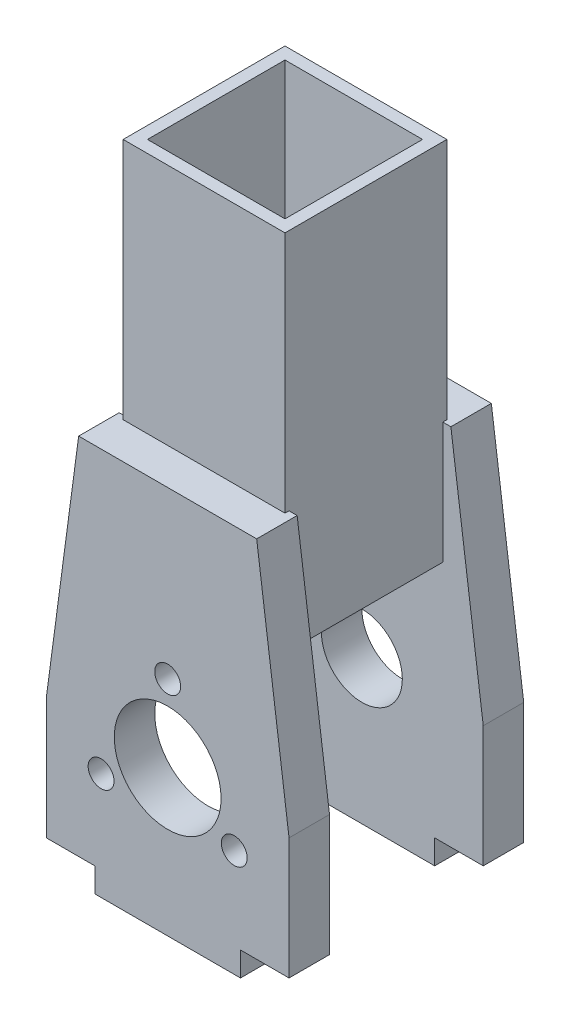
ISO-10303-21;
HEADER;
FILE_DESCRIPTION(('STEP AP214'),'2;1');
FILE_NAME('part.step','',(''),(''),'','','');
FILE_SCHEMA(('AUTOMOTIVE_DESIGN { 1 0 10303 214 1 1 1 1 }'));
ENDSEC;
DATA;
#1=APPLICATION_CONTEXT('core data for automotive mechanical design processes');
#2=APPLICATION_PROTOCOL_DEFINITION('international standard','automotive_design',2000,#1);
#3=PRODUCT_CONTEXT('',#1,'mechanical');
#4=PRODUCT('Part','Part','',(#3));
#5=PRODUCT_RELATED_PRODUCT_CATEGORY('part','',(#4));
#6=PRODUCT_DEFINITION_FORMATION('','',#4);
#7=PRODUCT_DEFINITION_CONTEXT('part definition',#1,'design');
#8=PRODUCT_DEFINITION('design','',#6,#7);
#9=PRODUCT_DEFINITION_SHAPE('','',#8);
#10=(LENGTH_UNIT() NAMED_UNIT(*) SI_UNIT(.MILLI.,.METRE.));
#11=(NAMED_UNIT(*) PLANE_ANGLE_UNIT() SI_UNIT($,.RADIAN.));
#12=(NAMED_UNIT(*) SI_UNIT($,.STERADIAN.) SOLID_ANGLE_UNIT());
#13=UNCERTAINTY_MEASURE_WITH_UNIT(LENGTH_MEASURE(1.E-05),#10,'distance_accuracy_value','');
#14=(GEOMETRIC_REPRESENTATION_CONTEXT(3) GLOBAL_UNCERTAINTY_ASSIGNED_CONTEXT((#13)) GLOBAL_UNIT_ASSIGNED_CONTEXT((#10,
#11,#12)) REPRESENTATION_CONTEXT('',''));
#15=CARTESIAN_POINT('',(0.,0.,0.));
#16=DIRECTION('',(0.,0.,1.));
#17=DIRECTION('',(1.,0.,0.));
#18=AXIS2_PLACEMENT_3D('',#15,#16,#17);
#19=CARTESIAN_POINT('',(1.00298557338295E-13,75.,0.));
#20=DIRECTION('',(0.,1.,0.));
#21=DIRECTION('',(-1.,0.,0.));
#22=AXIS2_PLACEMENT_3D('',#19,#20,#21);
#23=PLANE('',#22);
#24=DIRECTION('',(0.,0.,-1.));
#25=VECTOR('',#24,1.);
#26=CARTESIAN_POINT('',(10.0000000000001,75.,-10.));
#27=LINE('',#26,#25);
#28=CARTESIAN_POINT('',(10.0000000000001,75.,10.));
#29=VERTEX_POINT('',#28);
#30=CARTESIAN_POINT('',(10.0000000000001,75.,-10.));
#31=VERTEX_POINT('',#30);
#32=EDGE_CURVE('E122',#29,#31,#27,.T.);
#33=ORIENTED_EDGE('',*,*,#32,.T.);
#34=DIRECTION('',(-1.,0.,0.));
#35=VECTOR('',#34,1.);
#36=CARTESIAN_POINT('',(-9.99999999999991,75.,-10.));
#37=LINE('',#36,#35);
#38=CARTESIAN_POINT('',(-9.99999999999991,75.,-10.));
#39=VERTEX_POINT('',#38);
#40=EDGE_CURVE('E165',#31,#39,#37,.T.);
#41=ORIENTED_EDGE('',*,*,#40,.T.);
#42=DIRECTION('',(0.,0.,1.));
#43=VECTOR('',#42,1.);
#44=CARTESIAN_POINT('',(-9.99999999999991,75.,-10.));
#45=LINE('',#44,#43);
#46=CARTESIAN_POINT('',(-9.9999999999999,75.,10.));
#47=VERTEX_POINT('',#46);
#48=EDGE_CURVE('E167',#39,#47,#45,.T.);
#49=ORIENTED_EDGE('',*,*,#48,.T.);
#50=DIRECTION('',(1.,0.,0.));
#51=VECTOR('',#50,1.);
#52=CARTESIAN_POINT('',(-9.9999999999999,75.,10.));
#53=LINE('',#52,#51);
#54=EDGE_CURVE('E69',#47,#29,#53,.T.);
#55=ORIENTED_EDGE('',*,*,#54,.T.);
#56=EDGE_LOOP('',(#33,#41,#49,#55));
#57=FACE_BOUND('',#56,.T.);
#58=DIRECTION('',(1.,0.,0.));
#59=VECTOR('',#58,1.);
#60=CARTESIAN_POINT('',(-8.49999999999991,75.,8.5));
#61=LINE('',#60,#59);
#62=CARTESIAN_POINT('',(-8.49999999999991,75.,8.5));
#63=VERTEX_POINT('',#62);
#64=CARTESIAN_POINT('',(8.50000000000009,75.,8.5));
#65=VERTEX_POINT('',#64);
#66=EDGE_CURVE('E154',#63,#65,#61,.T.);
#67=ORIENTED_EDGE('',*,*,#66,.F.);
#68=DIRECTION('',(0.,0.,1.));
#69=VECTOR('',#68,1.);
#70=CARTESIAN_POINT('',(-8.49999999999991,75.,-8.5));
#71=LINE('',#70,#69);
#72=CARTESIAN_POINT('',(-8.49999999999991,75.,-8.5));
#73=VERTEX_POINT('',#72);
#74=EDGE_CURVE('E119',#73,#63,#71,.T.);
#75=ORIENTED_EDGE('',*,*,#74,.F.);
#76=DIRECTION('',(-1.,0.,0.));
#77=VECTOR('',#76,1.);
#78=CARTESIAN_POINT('',(-8.49999999999991,75.,-8.5));
#79=LINE('',#78,#77);
#80=CARTESIAN_POINT('',(8.50000000000009,75.,-8.5));
#81=VERTEX_POINT('',#80);
#82=EDGE_CURVE('E158',#81,#73,#79,.T.);
#83=ORIENTED_EDGE('',*,*,#82,.F.);
#84=DIRECTION('',(0.,0.,-1.));
#85=VECTOR('',#84,1.);
#86=CARTESIAN_POINT('',(8.50000000000009,75.,-8.5));
#87=LINE('',#86,#85);
#88=EDGE_CURVE('E156',#65,#81,#87,.T.);
#89=ORIENTED_EDGE('',*,*,#88,.F.);
#90=EDGE_LOOP('',(#67,#75,#83,#89));
#91=FACE_BOUND('',#90,.T.);
#92=ADVANCED_FACE('F46',(#57,#91),#23,.T.);
#93=CARTESIAN_POINT('',(10.0000000000001,75.,-10.));
#94=DIRECTION('',(-1.,0.,0.));
#95=DIRECTION('',(0.,-1.,0.));
#96=AXIS2_PLACEMENT_3D('',#93,#94,#95);
#97=PLANE('',#96);
#98=DIRECTION('',(0.,-1.,0.));
#99=VECTOR('',#98,1.);
#100=CARTESIAN_POINT('',(10.0000000000001,75.,10.));
#101=LINE('',#100,#99);
#102=CARTESIAN_POINT('',(10.,30.,10.));
#103=VERTEX_POINT('',#102);
#104=EDGE_CURVE('E170',#29,#103,#101,.T.);
#105=ORIENTED_EDGE('',*,*,#104,.T.);
#106=DIRECTION('',(0.,0.,-1.));
#107=VECTOR('',#106,1.);
#108=CARTESIAN_POINT('',(10.,30.,-10.));
#109=LINE('',#108,#107);
#110=CARTESIAN_POINT('',(10.,30.,-10.));
#111=VERTEX_POINT('',#110);
#112=EDGE_CURVE('E141',#103,#111,#109,.T.);
#113=ORIENTED_EDGE('',*,*,#112,.T.);
#114=DIRECTION('',(0.,-1.,0.));
#115=VECTOR('',#114,1.);
#116=CARTESIAN_POINT('',(10.0000000000001,75.,-10.));
#117=LINE('',#116,#115);
#118=EDGE_CURVE('E12',#31,#111,#117,.T.);
#119=ORIENTED_EDGE('',*,*,#118,.F.);
#120=ORIENTED_EDGE('',*,*,#32,.F.);
#121=EDGE_LOOP('',(#105,#113,#119,#120));
#122=FACE_BOUND('',#121,.T.);
#123=ADVANCED_FACE('F48',(#122),#97,.F.);
#124=CARTESIAN_POINT('',(-9.99999999999991,75.,-10.));
#125=DIRECTION('',(0.,0.,1.));
#126=DIRECTION('',(1.,0.,0.));
#127=AXIS2_PLACEMENT_3D('',#124,#125,#126);
#128=PLANE('',#127);
#129=ORIENTED_EDGE('',*,*,#118,.T.);
#130=DIRECTION('',(-1.,0.,0.));
#131=VECTOR('',#130,1.);
#132=CARTESIAN_POINT('',(-9.99999999999997,30.,-10.));
#133=LINE('',#132,#131);
#134=CARTESIAN_POINT('',(-9.99999999999997,30.,-10.));
#135=VERTEX_POINT('',#134);
#136=EDGE_CURVE('E144',#111,#135,#133,.T.);
#137=ORIENTED_EDGE('',*,*,#136,.T.);
#138=DIRECTION('',(0.,-1.,0.));
#139=VECTOR('',#138,1.);
#140=CARTESIAN_POINT('',(-9.99999999999991,75.,-10.));
#141=LINE('',#140,#139);
#142=EDGE_CURVE('E54',#39,#135,#141,.T.);
#143=ORIENTED_EDGE('',*,*,#142,.F.);
#144=ORIENTED_EDGE('',*,*,#40,.F.);
#145=EDGE_LOOP('',(#129,#137,#143,#144));
#146=FACE_BOUND('',#145,.T.);
#147=ADVANCED_FACE('F183',(#146),#128,.F.);
#148=CARTESIAN_POINT('',(-9.99999999999991,75.,-10.));
#149=DIRECTION('',(1.,0.,0.));
#150=DIRECTION('',(0.,1.,0.));
#151=AXIS2_PLACEMENT_3D('',#148,#149,#150);
#152=PLANE('',#151);
#153=ORIENTED_EDGE('',*,*,#142,.T.);
#154=DIRECTION('',(0.,0.,1.));
#155=VECTOR('',#154,1.);
#156=CARTESIAN_POINT('',(-9.99999999999997,30.,-10.));
#157=LINE('',#156,#155);
#158=CARTESIAN_POINT('',(-9.99999999999996,30.,10.));
#159=VERTEX_POINT('',#158);
#160=EDGE_CURVE('E147',#135,#159,#157,.T.);
#161=ORIENTED_EDGE('',*,*,#160,.T.);
#162=DIRECTION('',(0.,-1.,0.));
#163=VECTOR('',#162,1.);
#164=CARTESIAN_POINT('',(-9.9999999999999,75.,10.));
#165=LINE('',#164,#163);
#166=EDGE_CURVE('E172',#47,#159,#165,.T.);
#167=ORIENTED_EDGE('',*,*,#166,.F.);
#168=ORIENTED_EDGE('',*,*,#48,.F.);
#169=EDGE_LOOP('',(#153,#161,#167,#168));
#170=FACE_BOUND('',#169,.T.);
#171=ADVANCED_FACE('F177',(#170),#152,.F.);
#172=CARTESIAN_POINT('',(-9.9999999999999,75.,10.));
#173=DIRECTION('',(0.,0.,-1.));
#174=DIRECTION('',(-1.,0.,0.));
#175=AXIS2_PLACEMENT_3D('',#172,#173,#174);
#176=PLANE('',#175);
#177=ORIENTED_EDGE('',*,*,#166,.T.);
#178=DIRECTION('',(1.,0.,0.));
#179=VECTOR('',#178,1.);
#180=CARTESIAN_POINT('',(-9.99999999999996,30.,10.));
#181=LINE('',#180,#179);
#182=EDGE_CURVE('E150',#159,#103,#181,.T.);
#183=ORIENTED_EDGE('',*,*,#182,.T.);
#184=ORIENTED_EDGE('',*,*,#104,.F.);
#185=ORIENTED_EDGE('',*,*,#54,.F.);
#186=EDGE_LOOP('',(#177,#183,#184,#185));
#187=FACE_BOUND('',#186,.T.);
#188=ADVANCED_FACE('F188',(#187),#176,.F.);
#189=CARTESIAN_POINT('',(-8.49999999999991,75.,-8.5));
#190=DIRECTION('',(1.,0.,0.));
#191=DIRECTION('',(0.,1.,0.));
#192=AXIS2_PLACEMENT_3D('',#189,#190,#191);
#193=PLANE('',#192);
#194=DIRECTION('',(0.,-1.,0.));
#195=VECTOR('',#194,1.);
#196=CARTESIAN_POINT('',(-8.49999999999991,75.,8.5));
#197=LINE('',#196,#195);
#198=CARTESIAN_POINT('',(-8.49999999999996,30.,8.5));
#199=VERTEX_POINT('',#198);
#200=EDGE_CURVE('E111',#63,#199,#197,.T.);
#201=ORIENTED_EDGE('',*,*,#200,.T.);
#202=DIRECTION('',(0.,0.,1.));
#203=VECTOR('',#202,1.);
#204=CARTESIAN_POINT('',(-8.49999999999997,30.,-8.5));
#205=LINE('',#204,#203);
#206=CARTESIAN_POINT('',(-8.49999999999997,30.,-8.5));
#207=VERTEX_POINT('',#206);
#208=EDGE_CURVE('E116',#207,#199,#205,.T.);
#209=ORIENTED_EDGE('',*,*,#208,.F.);
#210=DIRECTION('',(0.,-1.,0.));
#211=VECTOR('',#210,1.);
#212=CARTESIAN_POINT('',(-8.49999999999991,75.,-8.5));
#213=LINE('',#212,#211);
#214=EDGE_CURVE('E160',#73,#207,#213,.T.);
#215=ORIENTED_EDGE('',*,*,#214,.F.);
#216=ORIENTED_EDGE('',*,*,#74,.T.);
#217=EDGE_LOOP('',(#201,#209,#215,#216));
#218=FACE_BOUND('',#217,.T.);
#219=ADVANCED_FACE('F113',(#218),#193,.T.);
#220=CARTESIAN_POINT('',(-8.49999999999991,75.,8.5));
#221=DIRECTION('',(0.,0.,-1.));
#222=DIRECTION('',(-1.,0.,0.));
#223=AXIS2_PLACEMENT_3D('',#220,#221,#222);
#224=PLANE('',#223);
#225=DIRECTION('',(0.,-1.,0.));
#226=VECTOR('',#225,1.);
#227=CARTESIAN_POINT('',(8.50000000000009,75.,8.5));
#228=LINE('',#227,#226);
#229=CARTESIAN_POINT('',(8.50000000000006,30.,8.49999999999999));
#230=VERTEX_POINT('',#229);
#231=EDGE_CURVE('E123',#65,#230,#228,.T.);
#232=ORIENTED_EDGE('',*,*,#231,.T.);
#233=DIRECTION('',(1.,0.,0.));
#234=VECTOR('',#233,1.);
#235=CARTESIAN_POINT('',(-8.49999999999996,30.,8.5));
#236=LINE('',#235,#234);
#237=EDGE_CURVE('E126',#199,#230,#236,.T.);
#238=ORIENTED_EDGE('',*,*,#237,.F.);
#239=ORIENTED_EDGE('',*,*,#200,.F.);
#240=ORIENTED_EDGE('',*,*,#66,.T.);
#241=EDGE_LOOP('',(#232,#238,#239,#240));
#242=FACE_BOUND('',#241,.T.);
#243=ADVANCED_FACE('F127',(#242),#224,.T.);
#244=CARTESIAN_POINT('',(8.50000000000009,75.,-8.5));
#245=DIRECTION('',(-1.,0.,0.));
#246=DIRECTION('',(0.,-1.,0.));
#247=AXIS2_PLACEMENT_3D('',#244,#245,#246);
#248=PLANE('',#247);
#249=DIRECTION('',(0.,-1.,0.));
#250=VECTOR('',#249,1.);
#251=CARTESIAN_POINT('',(8.50000000000009,75.,-8.5));
#252=LINE('',#251,#250);
#253=CARTESIAN_POINT('',(8.50000000000004,30.,-8.5));
#254=VERTEX_POINT('',#253);
#255=EDGE_CURVE('E61',#81,#254,#252,.T.);
#256=ORIENTED_EDGE('',*,*,#255,.T.);
#257=DIRECTION('',(0.,0.,-1.));
#258=VECTOR('',#257,1.);
#259=CARTESIAN_POINT('',(8.50000000000004,30.,-8.5));
#260=LINE('',#259,#258);
#261=EDGE_CURVE('E132',#230,#254,#260,.T.);
#262=ORIENTED_EDGE('',*,*,#261,.F.);
#263=ORIENTED_EDGE('',*,*,#231,.F.);
#264=ORIENTED_EDGE('',*,*,#88,.T.);
#265=EDGE_LOOP('',(#256,#262,#263,#264));
#266=FACE_BOUND('',#265,.T.);
#267=ADVANCED_FACE('F206',(#266),#248,.T.);
#268=CARTESIAN_POINT('',(-8.49999999999991,75.,-8.5));
#269=DIRECTION('',(0.,0.,1.));
#270=DIRECTION('',(1.,0.,0.));
#271=AXIS2_PLACEMENT_3D('',#268,#269,#270);
#272=PLANE('',#271);
#273=ORIENTED_EDGE('',*,*,#214,.T.);
#274=DIRECTION('',(-1.,0.,0.));
#275=VECTOR('',#274,1.);
#276=CARTESIAN_POINT('',(-8.49999999999997,30.,-8.5));
#277=LINE('',#276,#275);
#278=EDGE_CURVE('E136',#254,#207,#277,.T.);
#279=ORIENTED_EDGE('',*,*,#278,.F.);
#280=ORIENTED_EDGE('',*,*,#255,.F.);
#281=ORIENTED_EDGE('',*,*,#82,.T.);
#282=EDGE_LOOP('',(#273,#279,#280,#281));
#283=FACE_BOUND('',#282,.T.);
#284=ADVANCED_FACE('F209',(#283),#272,.T.);
#285=CARTESIAN_POINT('',(0.,30.,0.));
#286=DIRECTION('',(0.,1.,0.));
#287=DIRECTION('',(-1.,0.,0.));
#288=AXIS2_PLACEMENT_3D('',#285,#286,#287);
#289=PLANE('',#288);
#290=ORIENTED_EDGE('',*,*,#278,.T.);
#291=ORIENTED_EDGE('',*,*,#208,.T.);
#292=ORIENTED_EDGE('',*,*,#237,.T.);
#293=ORIENTED_EDGE('',*,*,#261,.T.);
#294=EDGE_LOOP('',(#290,#291,#292,#293));
#295=FACE_BOUND('',#294,.T.);
#296=ORIENTED_EDGE('',*,*,#112,.F.);
#297=ORIENTED_EDGE('',*,*,#182,.F.);
#298=ORIENTED_EDGE('',*,*,#160,.F.);
#299=ORIENTED_EDGE('',*,*,#136,.F.);
#300=EDGE_LOOP('',(#296,#297,#298,#299));
#301=FACE_BOUND('',#300,.T.);
#302=ADVANCED_FACE('F134',(#295,#301),#289,.F.);
#303=CLOSED_SHELL('',(#92,#123,#147,#171,#188,#219,#243,#267,#284,#302));
#304=MANIFOLD_SOLID_BREP('B2',#303);
#305=CARTESIAN_POINT('',(15.,15.,-14.5));
#306=DIRECTION('',(1.,0.,0.));
#307=DIRECTION('',(0.,1.,0.));
#308=AXIS2_PLACEMENT_3D('',#305,#306,#307);
#309=PLANE('',#308);
#310=DIRECTION('',(0.,1.,0.));
#311=VECTOR('',#310,1.);
#312=CARTESIAN_POINT('',(15.,15.,-9.5));
#313=LINE('',#312,#311);
#314=CARTESIAN_POINT('',(15.,0.,-9.5));
#315=VERTEX_POINT('',#314);
#316=CARTESIAN_POINT('',(15.,15.,-9.5));
#317=VERTEX_POINT('',#316);
#318=EDGE_CURVE('E394',#315,#317,#313,.T.);
#319=ORIENTED_EDGE('',*,*,#318,.F.);
#320=DIRECTION('',(0.,0.,1.));
#321=VECTOR('',#320,1.);
#322=CARTESIAN_POINT('',(15.,0.,-14.5));
#323=LINE('',#322,#321);
#324=CARTESIAN_POINT('',(15.,0.,-14.5));
#325=VERTEX_POINT('',#324);
#326=EDGE_CURVE('E44',#325,#315,#323,.T.);
#327=ORIENTED_EDGE('',*,*,#326,.F.);
#328=DIRECTION('',(0.,1.,0.));
#329=VECTOR('',#328,1.);
#330=CARTESIAN_POINT('',(15.,15.,-14.5));
#331=LINE('',#330,#329);
#332=CARTESIAN_POINT('',(15.,15.,-14.5));
#333=VERTEX_POINT('',#332);
#334=EDGE_CURVE('E421',#325,#333,#331,.T.);
#335=ORIENTED_EDGE('',*,*,#334,.T.);
#336=DIRECTION('',(0.,0.,1.));
#337=VECTOR('',#336,1.);
#338=CARTESIAN_POINT('',(15.,15.,-14.5));
#339=LINE('',#338,#337);
#340=EDGE_CURVE('E288',#333,#317,#339,.T.);
#341=ORIENTED_EDGE('',*,*,#340,.T.);
#342=EDGE_LOOP('',(#319,#327,#335,#341));
#343=FACE_BOUND('',#342,.T.);
#344=ADVANCED_FACE('F285',(#343),#309,.T.);
#345=CARTESIAN_POINT('',(15.,0.,-14.5));
#346=DIRECTION('',(0.,-1.,0.));
#347=DIRECTION('',(1.,0.,0.));
#348=AXIS2_PLACEMENT_3D('',#345,#346,#347);
#349=PLANE('',#348);
#350=DIRECTION('',(1.,0.,0.));
#351=VECTOR('',#350,1.);
#352=CARTESIAN_POINT('',(15.,0.,-9.5));
#353=LINE('',#352,#351);
#354=CARTESIAN_POINT('',(9.,0.,-9.5));
#355=VERTEX_POINT('',#354);
#356=EDGE_CURVE('E419',#355,#315,#353,.T.);
#357=ORIENTED_EDGE('',*,*,#356,.F.);
#358=DIRECTION('',(0.,0.,1.));
#359=VECTOR('',#358,1.);
#360=CARTESIAN_POINT('',(9.,0.,-14.5));
#361=LINE('',#360,#359);
#362=CARTESIAN_POINT('',(9.,0.,-14.5));
#363=VERTEX_POINT('',#362);
#364=EDGE_CURVE('E294',#363,#355,#361,.T.);
#365=ORIENTED_EDGE('',*,*,#364,.F.);
#366=DIRECTION('',(1.,0.,0.));
#367=VECTOR('',#366,1.);
#368=CARTESIAN_POINT('',(15.,0.,-14.5));
#369=LINE('',#368,#367);
#370=EDGE_CURVE('E384',#363,#325,#369,.T.);
#371=ORIENTED_EDGE('',*,*,#370,.T.);
#372=ORIENTED_EDGE('',*,*,#326,.T.);
#373=EDGE_LOOP('',(#357,#365,#371,#372));
#374=FACE_BOUND('',#373,.T.);
#375=ADVANCED_FACE('F437',(#374),#349,.T.);
#376=CARTESIAN_POINT('',(9.,0.,-14.5));
#377=DIRECTION('',(1.,0.,0.));
#378=DIRECTION('',(0.,1.,0.));
#379=AXIS2_PLACEMENT_3D('',#376,#377,#378);
#380=PLANE('',#379);
#381=DIRECTION('',(0.,1.,0.));
#382=VECTOR('',#381,1.);
#383=CARTESIAN_POINT('',(9.,0.,-9.5));
#384=LINE('',#383,#382);
#385=CARTESIAN_POINT('',(9.,-3.,-9.5));
#386=VERTEX_POINT('',#385);
#387=EDGE_CURVE('E371',#386,#355,#384,.T.);
#388=ORIENTED_EDGE('',*,*,#387,.F.);
#389=DIRECTION('',(0.,0.,1.));
#390=VECTOR('',#389,1.);
#391=CARTESIAN_POINT('',(9.,-3.,-14.5));
#392=LINE('',#391,#390);
#393=CARTESIAN_POINT('',(9.,-3.,-14.5));
#394=VERTEX_POINT('',#393);
#395=EDGE_CURVE('E366',#394,#386,#392,.T.);
#396=ORIENTED_EDGE('',*,*,#395,.F.);
#397=DIRECTION('',(0.,1.,0.));
#398=VECTOR('',#397,1.);
#399=CARTESIAN_POINT('',(9.,0.,-14.5));
#400=LINE('',#399,#398);
#401=EDGE_CURVE('E369',#394,#363,#400,.T.);
#402=ORIENTED_EDGE('',*,*,#401,.T.);
#403=ORIENTED_EDGE('',*,*,#364,.T.);
#404=EDGE_LOOP('',(#388,#396,#402,#403));
#405=FACE_BOUND('',#404,.T.);
#406=ADVANCED_FACE('F368',(#405),#380,.T.);
#407=CARTESIAN_POINT('',(9.,-3.,-14.5));
#408=DIRECTION('',(0.,-1.,0.));
#409=DIRECTION('',(0.,0.,-1.));
#410=AXIS2_PLACEMENT_3D('',#407,#408,#409);
#411=PLANE('',#410);
#412=DIRECTION('',(1.,0.,0.));
#413=VECTOR('',#412,1.);
#414=CARTESIAN_POINT('',(9.,-3.,-9.5));
#415=LINE('',#414,#413);
#416=CARTESIAN_POINT('',(-9.,-3.,-9.5));
#417=VERTEX_POINT('',#416);
#418=EDGE_CURVE('E416',#417,#386,#415,.T.);
#419=ORIENTED_EDGE('',*,*,#418,.F.);
#420=DIRECTION('',(0.,0.,1.));
#421=VECTOR('',#420,1.);
#422=CARTESIAN_POINT('',(-9.,-3.,-14.5));
#423=LINE('',#422,#421);
#424=CARTESIAN_POINT('',(-9.,-3.,-14.5));
#425=VERTEX_POINT('',#424);
#426=EDGE_CURVE('E376',#425,#417,#423,.T.);
#427=ORIENTED_EDGE('',*,*,#426,.F.);
#428=DIRECTION('',(1.,0.,0.));
#429=VECTOR('',#428,1.);
#430=CARTESIAN_POINT('',(9.,-3.,-14.5));
#431=LINE('',#430,#429);
#432=EDGE_CURVE('E382',#425,#394,#431,.T.);
#433=ORIENTED_EDGE('',*,*,#432,.T.);
#434=ORIENTED_EDGE('',*,*,#395,.T.);
#435=EDGE_LOOP('',(#419,#427,#433,#434));
#436=FACE_BOUND('',#435,.T.);
#437=ADVANCED_FACE('F386',(#436),#411,.T.);
#438=CARTESIAN_POINT('',(-9.,0.,-14.5));
#439=DIRECTION('',(-1.,0.,0.));
#440=DIRECTION('',(0.,-1.,0.));
#441=AXIS2_PLACEMENT_3D('',#438,#439,#440);
#442=PLANE('',#441);
#443=DIRECTION('',(0.,-1.,0.));
#444=VECTOR('',#443,1.);
#445=CARTESIAN_POINT('',(-9.,0.,-9.5));
#446=LINE('',#445,#444);
#447=CARTESIAN_POINT('',(-9.,0.,-9.5));
#448=VERTEX_POINT('',#447);
#449=EDGE_CURVE('E413',#448,#417,#446,.T.);
#450=ORIENTED_EDGE('',*,*,#449,.F.);
#451=DIRECTION('',(0.,0.,1.));
#452=VECTOR('',#451,1.);
#453=CARTESIAN_POINT('',(-9.,0.,-14.5));
#454=LINE('',#453,#452);
#455=CARTESIAN_POINT('',(-9.,0.,-14.5));
#456=VERTEX_POINT('',#455);
#457=EDGE_CURVE('E425',#456,#448,#454,.T.);
#458=ORIENTED_EDGE('',*,*,#457,.F.);
#459=DIRECTION('',(0.,-1.,0.));
#460=VECTOR('',#459,1.);
#461=CARTESIAN_POINT('',(-9.,0.,-14.5));
#462=LINE('',#461,#460);
#463=EDGE_CURVE('E387',#456,#425,#462,.T.);
#464=ORIENTED_EDGE('',*,*,#463,.T.);
#465=ORIENTED_EDGE('',*,*,#426,.T.);
#466=EDGE_LOOP('',(#450,#458,#464,#465));
#467=FACE_BOUND('',#466,.T.);
#468=ADVANCED_FACE('F450',(#467),#442,.T.);
#469=CARTESIAN_POINT('',(-15.,0.,-14.5));
#470=DIRECTION('',(0.,-1.,0.));
#471=DIRECTION('',(1.,0.,0.));
#472=AXIS2_PLACEMENT_3D('',#469,#470,#471);
#473=PLANE('',#472);
#474=DIRECTION('',(1.,0.,0.));
#475=VECTOR('',#474,1.);
#476=CARTESIAN_POINT('',(-15.,0.,-9.5));
#477=LINE('',#476,#475);
#478=CARTESIAN_POINT('',(-15.,0.,-9.5));
#479=VERTEX_POINT('',#478);
#480=EDGE_CURVE('E410',#479,#448,#477,.T.);
#481=ORIENTED_EDGE('',*,*,#480,.F.);
#482=DIRECTION('',(0.,0.,1.));
#483=VECTOR('',#482,1.);
#484=CARTESIAN_POINT('',(-15.,0.,-14.5));
#485=LINE('',#484,#483);
#486=CARTESIAN_POINT('',(-15.,0.,-14.5));
#487=VERTEX_POINT('',#486);
#488=EDGE_CURVE('E427',#487,#479,#485,.T.);
#489=ORIENTED_EDGE('',*,*,#488,.F.);
#490=DIRECTION('',(1.,0.,0.));
#491=VECTOR('',#490,1.);
#492=CARTESIAN_POINT('',(-15.,0.,-14.5));
#493=LINE('',#492,#491);
#494=EDGE_CURVE('E389',#487,#456,#493,.T.);
#495=ORIENTED_EDGE('',*,*,#494,.T.);
#496=ORIENTED_EDGE('',*,*,#457,.T.);
#497=EDGE_LOOP('',(#481,#489,#495,#496));
#498=FACE_BOUND('',#497,.T.);
#499=ADVANCED_FACE('F453',(#498),#473,.T.);
#500=CARTESIAN_POINT('',(-15.,15.,-14.5));
#501=DIRECTION('',(-1.,0.,0.));
#502=DIRECTION('',(0.,-1.,0.));
#503=AXIS2_PLACEMENT_3D('',#500,#501,#502);
#504=PLANE('',#503);
#505=DIRECTION('',(0.,-1.,0.));
#506=VECTOR('',#505,1.);
#507=CARTESIAN_POINT('',(-15.,15.,-9.5));
#508=LINE('',#507,#506);
#509=CARTESIAN_POINT('',(-15.,15.,-9.5));
#510=VERTEX_POINT('',#509);
#511=EDGE_CURVE('E407',#510,#479,#508,.T.);
#512=ORIENTED_EDGE('',*,*,#511,.F.);
#513=DIRECTION('',(0.,0.,1.));
#514=VECTOR('',#513,1.);
#515=CARTESIAN_POINT('',(-15.,15.,-14.5));
#516=LINE('',#515,#514);
#517=CARTESIAN_POINT('',(-15.,15.,-14.5));
#518=VERTEX_POINT('',#517);
#519=EDGE_CURVE('E429',#518,#510,#516,.T.);
#520=ORIENTED_EDGE('',*,*,#519,.F.);
#521=DIRECTION('',(0.,-1.,0.));
#522=VECTOR('',#521,1.);
#523=CARTESIAN_POINT('',(-15.,15.,-14.5));
#524=LINE('',#523,#522);
#525=EDGE_CURVE('E502',#518,#487,#524,.T.);
#526=ORIENTED_EDGE('',*,*,#525,.T.);
#527=ORIENTED_EDGE('',*,*,#488,.T.);
#528=EDGE_LOOP('',(#512,#520,#526,#527));
#529=FACE_BOUND('',#528,.T.);
#530=ADVANCED_FACE('F457',(#529),#504,.T.);
#531=CARTESIAN_POINT('',(-11.,45.,-14.5));
#532=DIRECTION('',(-0.991227900682635,0.132163720091018,0.));
#533=DIRECTION('',(-0.132163720091018,-0.991227900682635,0.));
#534=AXIS2_PLACEMENT_3D('',#531,#532,#533);
#535=PLANE('',#534);
#536=DIRECTION('',(-0.132163720091018,-0.991227900682635,0.));
#537=VECTOR('',#536,1.);
#538=CARTESIAN_POINT('',(-11.,45.,-9.5));
#539=LINE('',#538,#537);
#540=CARTESIAN_POINT('',(-11.,45.,-9.5));
#541=VERTEX_POINT('',#540);
#542=EDGE_CURVE('E404',#541,#510,#539,.T.);
#543=ORIENTED_EDGE('',*,*,#542,.F.);
#544=DIRECTION('',(0.,0.,1.));
#545=VECTOR('',#544,1.);
#546=CARTESIAN_POINT('',(-11.,45.,-14.5));
#547=LINE('',#546,#545);
#548=CARTESIAN_POINT('',(-11.,45.,-14.5));
#549=VERTEX_POINT('',#548);
#550=EDGE_CURVE('E431',#549,#541,#547,.T.);
#551=ORIENTED_EDGE('',*,*,#550,.F.);
#552=DIRECTION('',(-0.132163720091018,-0.991227900682635,0.));
#553=VECTOR('',#552,1.);
#554=CARTESIAN_POINT('',(-11.,45.,-14.5));
#555=LINE('',#554,#553);
#556=EDGE_CURVE('E499',#549,#518,#555,.T.);
#557=ORIENTED_EDGE('',*,*,#556,.T.);
#558=ORIENTED_EDGE('',*,*,#519,.T.);
#559=EDGE_LOOP('',(#543,#551,#557,#558));
#560=FACE_BOUND('',#559,.T.);
#561=ADVANCED_FACE('F461',(#560),#535,.T.);
#562=CARTESIAN_POINT('',(-11.,45.,-14.5));
#563=DIRECTION('',(0.,1.,0.));
#564=DIRECTION('',(0.,0.,1.));
#565=AXIS2_PLACEMENT_3D('',#562,#563,#564);
#566=PLANE('',#565);
#567=DIRECTION('',(-1.,0.,0.));
#568=VECTOR('',#567,1.);
#569=CARTESIAN_POINT('',(-11.,45.,-9.5));
#570=LINE('',#569,#568);
#571=CARTESIAN_POINT('',(11.,45.,-9.5));
#572=VERTEX_POINT('',#571);
#573=EDGE_CURVE('E401',#572,#541,#570,.T.);
#574=ORIENTED_EDGE('',*,*,#573,.F.);
#575=DIRECTION('',(0.,0.,1.));
#576=VECTOR('',#575,1.);
#577=CARTESIAN_POINT('',(11.,45.,-14.5));
#578=LINE('',#577,#576);
#579=CARTESIAN_POINT('',(11.,45.,-14.5));
#580=VERTEX_POINT('',#579);
#581=EDGE_CURVE('E432',#580,#572,#578,.T.);
#582=ORIENTED_EDGE('',*,*,#581,.F.);
#583=DIRECTION('',(-1.,0.,0.));
#584=VECTOR('',#583,1.);
#585=CARTESIAN_POINT('',(-11.,45.,-14.5));
#586=LINE('',#585,#584);
#587=EDGE_CURVE('E496',#580,#549,#586,.T.);
#588=ORIENTED_EDGE('',*,*,#587,.T.);
#589=ORIENTED_EDGE('',*,*,#550,.T.);
#590=EDGE_LOOP('',(#574,#582,#588,#589));
#591=FACE_BOUND('',#590,.T.);
#592=ADVANCED_FACE('F465',(#591),#566,.T.);
#593=CARTESIAN_POINT('',(11.,45.,-14.5));
#594=DIRECTION('',(0.991227900682635,0.132163720091018,0.));
#595=DIRECTION('',(-0.132163720091018,0.991227900682635,0.));
#596=AXIS2_PLACEMENT_3D('',#593,#594,#595);
#597=PLANE('',#596);
#598=DIRECTION('',(-0.132163720091018,0.991227900682635,0.));
#599=VECTOR('',#598,1.);
#600=CARTESIAN_POINT('',(11.,45.,-9.5));
#601=LINE('',#600,#599);
#602=EDGE_CURVE('E397',#317,#572,#601,.T.);
#603=ORIENTED_EDGE('',*,*,#602,.F.);
#604=ORIENTED_EDGE('',*,*,#340,.F.);
#605=DIRECTION('',(-0.132163720091018,0.991227900682635,0.));
#606=VECTOR('',#605,1.);
#607=CARTESIAN_POINT('',(11.,45.,-14.5));
#608=LINE('',#607,#606);
#609=EDGE_CURVE('E494',#333,#580,#608,.T.);
#610=ORIENTED_EDGE('',*,*,#609,.T.);
#611=ORIENTED_EDGE('',*,*,#581,.T.);
#612=EDGE_LOOP('',(#603,#604,#610,#611));
#613=FACE_BOUND('',#612,.T.);
#614=ADVANCED_FACE('F434',(#613),#597,.T.);
#615=CARTESIAN_POINT('',(0.,0.,-14.5));
#616=DIRECTION('',(0.,0.,-1.));
#617=DIRECTION('',(-1.,0.,0.));
#618=AXIS2_PLACEMENT_3D('',#615,#616,#617);
#619=PLANE('',#618);
#620=CARTESIAN_POINT('',(0.,15.,-14.5));
#621=DIRECTION('',(0.,0.,1.));
#622=DIRECTION('',(1.,0.,0.));
#623=AXIS2_PLACEMENT_3D('',#620,#621,#622);
#624=CIRCLE('',#623,5.);
#625=CARTESIAN_POINT('',(5.,15.,-14.5));
#626=VERTEX_POINT('',#625);
#627=EDGE_CURVE('E398',#626,#626,#624,.T.);
#628=ORIENTED_EDGE('',*,*,#627,.T.);
#629=EDGE_LOOP('',(#628));
#630=FACE_BOUND('',#629,.T.);
#631=ORIENTED_EDGE('',*,*,#334,.F.);
#632=ORIENTED_EDGE('',*,*,#370,.F.);
#633=ORIENTED_EDGE('',*,*,#401,.F.);
#634=ORIENTED_EDGE('',*,*,#432,.F.);
#635=ORIENTED_EDGE('',*,*,#463,.F.);
#636=ORIENTED_EDGE('',*,*,#494,.F.);
#637=ORIENTED_EDGE('',*,*,#525,.F.);
#638=ORIENTED_EDGE('',*,*,#556,.F.);
#639=ORIENTED_EDGE('',*,*,#587,.F.);
#640=ORIENTED_EDGE('',*,*,#609,.F.);
#641=EDGE_LOOP('',(#631,#632,#633,#634,#635,#636,#637,#638,#639,#640));
#642=FACE_BOUND('',#641,.T.);
#643=ADVANCED_FACE('F380',(#630,#642),#619,.T.);
#644=CARTESIAN_POINT('',(0.,0.,-9.5));
#645=DIRECTION('',(0.,0.,-1.));
#646=DIRECTION('',(-1.,0.,0.));
#647=AXIS2_PLACEMENT_3D('',#644,#645,#646);
#648=PLANE('',#647);
#649=CARTESIAN_POINT('',(0.,15.,-9.5));
#650=DIRECTION('',(0.,0.,1.));
#651=DIRECTION('',(1.,0.,0.));
#652=AXIS2_PLACEMENT_3D('',#649,#650,#651);
#653=CIRCLE('',#652,5.);
#654=CARTESIAN_POINT('',(5.,15.,-9.5));
#655=VERTEX_POINT('',#654);
#656=EDGE_CURVE('E489',#655,#655,#653,.T.);
#657=ORIENTED_EDGE('',*,*,#656,.F.);
#658=EDGE_LOOP('',(#657));
#659=FACE_BOUND('',#658,.T.);
#660=ORIENTED_EDGE('',*,*,#318,.T.);
#661=ORIENTED_EDGE('',*,*,#602,.T.);
#662=ORIENTED_EDGE('',*,*,#573,.T.);
#663=ORIENTED_EDGE('',*,*,#542,.T.);
#664=ORIENTED_EDGE('',*,*,#511,.T.);
#665=ORIENTED_EDGE('',*,*,#480,.T.);
#666=ORIENTED_EDGE('',*,*,#449,.T.);
#667=ORIENTED_EDGE('',*,*,#418,.T.);
#668=ORIENTED_EDGE('',*,*,#387,.T.);
#669=ORIENTED_EDGE('',*,*,#356,.T.);
#670=EDGE_LOOP('',(#660,#661,#662,#663,#664,#665,#666,#667,#668,#669));
#671=FACE_BOUND('',#670,.T.);
#672=ADVANCED_FACE('F436',(#659,#671),#648,.F.);
#673=CARTESIAN_POINT('',(0.,15.,-14.5));
#674=DIRECTION('',(0.,0.,1.));
#675=DIRECTION('',(1.,0.,0.));
#676=AXIS2_PLACEMENT_3D('',#673,#674,#675);
#677=CYLINDRICAL_SURFACE('',#676,5.);
#678=ORIENTED_EDGE('',*,*,#627,.F.);
#679=EDGE_LOOP('',(#678));
#680=FACE_BOUND('',#679,.T.);
#681=ORIENTED_EDGE('',*,*,#656,.T.);
#682=EDGE_LOOP('',(#681));
#683=FACE_BOUND('',#682,.T.);
#684=ADVANCED_FACE('F477',(#680,#683),#677,.F.);
#685=CLOSED_SHELL('',(#344,#375,#406,#437,#468,#499,#530,#561,#592,#614,#643,#672,#684));
#686=MANIFOLD_SOLID_BREP('B6',#685);
#687=CARTESIAN_POINT('',(0.,0.,14.5));
#688=DIRECTION('',(0.,0.,1.));
#689=DIRECTION('',(1.,0.,0.));
#690=AXIS2_PLACEMENT_3D('',#687,#688,#689);
#691=PLANE('',#690);
#692=CARTESIAN_POINT('',(8.22724133595217,10.25,14.5));
#693=DIRECTION('',(0.,0.,1.));
#694=DIRECTION('',(1.,0.,0.));
#695=AXIS2_PLACEMENT_3D('',#692,#693,#694);
#696=CIRCLE('',#695,1.6);
#697=CARTESIAN_POINT('',(9.82724133595218,10.25,14.5));
#698=VERTEX_POINT('',#697);
#699=EDGE_CURVE('E771',#698,#698,#696,.T.);
#700=ORIENTED_EDGE('',*,*,#699,.F.);
#701=EDGE_LOOP('',(#700));
#702=FACE_BOUND('',#701,.T.);
#703=CARTESIAN_POINT('',(0.,24.5,14.5));
#704=DIRECTION('',(0.,0.,1.));
#705=DIRECTION('',(1.,0.,0.));
#706=AXIS2_PLACEMENT_3D('',#703,#704,#705);
#707=CIRCLE('',#706,1.6);
#708=CARTESIAN_POINT('',(1.6,24.5,14.5));
#709=VERTEX_POINT('',#708);
#710=EDGE_CURVE('E699',#709,#709,#707,.T.);
#711=ORIENTED_EDGE('',*,*,#710,.F.);
#712=EDGE_LOOP('',(#711));
#713=FACE_BOUND('',#712,.T.);
#714=DIRECTION('',(0.,-1.,0.));
#715=VECTOR('',#714,1.);
#716=CARTESIAN_POINT('',(-15.,15.,14.5));
#717=LINE('',#716,#715);
#718=CARTESIAN_POINT('',(-15.,15.,14.5));
#719=VERTEX_POINT('',#718);
#720=CARTESIAN_POINT('',(-15.,0.,14.5));
#721=VERTEX_POINT('',#720);
#722=EDGE_CURVE('E714',#719,#721,#717,.T.);
#723=ORIENTED_EDGE('',*,*,#722,.T.);
#724=DIRECTION('',(1.,0.,0.));
#725=VECTOR('',#724,1.);
#726=CARTESIAN_POINT('',(-15.,0.,14.5));
#727=LINE('',#726,#725);
#728=CARTESIAN_POINT('',(-9.,0.,14.5));
#729=VERTEX_POINT('',#728);
#730=EDGE_CURVE('E652',#721,#729,#727,.T.);
#731=ORIENTED_EDGE('',*,*,#730,.T.);
#732=DIRECTION('',(0.,-1.,0.));
#733=VECTOR('',#732,1.);
#734=CARTESIAN_POINT('',(-9.,0.,14.5));
#735=LINE('',#734,#733);
#736=CARTESIAN_POINT('',(-9.,-3.,14.5));
#737=VERTEX_POINT('',#736);
#738=EDGE_CURVE('E735',#729,#737,#735,.T.);
#739=ORIENTED_EDGE('',*,*,#738,.T.);
#740=DIRECTION('',(1.,0.,0.));
#741=VECTOR('',#740,1.);
#742=CARTESIAN_POINT('',(-9.,-3.,14.5));
#743=LINE('',#742,#741);
#744=CARTESIAN_POINT('',(9.,-3.,14.5));
#745=VERTEX_POINT('',#744);
#746=EDGE_CURVE('E754',#737,#745,#743,.T.);
#747=ORIENTED_EDGE('',*,*,#746,.T.);
#748=DIRECTION('',(0.,1.,0.));
#749=VECTOR('',#748,1.);
#750=CARTESIAN_POINT('',(9.,0.,14.5));
#751=LINE('',#750,#749);
#752=CARTESIAN_POINT('',(9.,0.,14.5));
#753=VERTEX_POINT('',#752);
#754=EDGE_CURVE('E751',#745,#753,#751,.T.);
#755=ORIENTED_EDGE('',*,*,#754,.T.);
#756=DIRECTION('',(1.,0.,0.));
#757=VECTOR('',#756,1.);
#758=CARTESIAN_POINT('',(15.,0.,14.5));
#759=LINE('',#758,#757);
#760=CARTESIAN_POINT('',(15.,0.,14.5));
#761=VERTEX_POINT('',#760);
#762=EDGE_CURVE('E753',#753,#761,#759,.T.);
#763=ORIENTED_EDGE('',*,*,#762,.T.);
#764=DIRECTION('',(0.,1.,0.));
#765=VECTOR('',#764,1.);
#766=CARTESIAN_POINT('',(15.,15.,14.5));
#767=LINE('',#766,#765);
#768=CARTESIAN_POINT('',(15.,15.,14.5));
#769=VERTEX_POINT('',#768);
#770=EDGE_CURVE('E677',#761,#769,#767,.T.);
#771=ORIENTED_EDGE('',*,*,#770,.T.);
#772=DIRECTION('',(-0.132163720091018,0.991227900682635,0.));
#773=VECTOR('',#772,1.);
#774=CARTESIAN_POINT('',(11.,45.,14.5));
#775=LINE('',#774,#773);
#776=CARTESIAN_POINT('',(11.,45.,14.5));
#777=VERTEX_POINT('',#776);
#778=EDGE_CURVE('E671',#769,#777,#775,.T.);
#779=ORIENTED_EDGE('',*,*,#778,.T.);
#780=DIRECTION('',(-1.,0.,0.));
#781=VECTOR('',#780,1.);
#782=CARTESIAN_POINT('',(-11.,45.,14.5));
#783=LINE('',#782,#781);
#784=CARTESIAN_POINT('',(-11.,45.,14.5));
#785=VERTEX_POINT('',#784);
#786=EDGE_CURVE('E675',#777,#785,#783,.T.);
#787=ORIENTED_EDGE('',*,*,#786,.T.);
#788=DIRECTION('',(-0.132163720091018,-0.991227900682635,0.));
#789=VECTOR('',#788,1.);
#790=CARTESIAN_POINT('',(-11.,45.,14.5));
#791=LINE('',#790,#789);
#792=EDGE_CURVE('E603',#785,#719,#791,.T.);
#793=ORIENTED_EDGE('',*,*,#792,.T.);
#794=EDGE_LOOP('',(#723,#731,#739,#747,#755,#763,#771,#779,#787,#793));
#795=FACE_BOUND('',#794,.T.);
#796=CARTESIAN_POINT('',(0.,15.,14.5));
#797=DIRECTION('',(0.,0.,1.));
#798=DIRECTION('',(1.,0.,0.));
#799=AXIS2_PLACEMENT_3D('',#796,#797,#798);
#800=CIRCLE('',#799,6.6);
#801=CARTESIAN_POINT('',(6.6,15.,14.5));
#802=VERTEX_POINT('',#801);
#803=EDGE_CURVE('E765',#802,#802,#800,.T.);
#804=ORIENTED_EDGE('',*,*,#803,.F.);
#805=EDGE_LOOP('',(#804));
#806=FACE_BOUND('',#805,.T.);
#807=CARTESIAN_POINT('',(-8.22724133595217,10.25,14.5));
#808=DIRECTION('',(0.,0.,1.));
#809=DIRECTION('',(1.,0.,0.));
#810=AXIS2_PLACEMENT_3D('',#807,#808,#809);
#811=CIRCLE('',#810,1.6);
#812=CARTESIAN_POINT('',(-6.62724133595217,10.25,14.5));
#813=VERTEX_POINT('',#812);
#814=EDGE_CURVE('E777',#813,#813,#811,.T.);
#815=ORIENTED_EDGE('',*,*,#814,.F.);
#816=EDGE_LOOP('',(#815));
#817=FACE_BOUND('',#816,.T.);
#818=ADVANCED_FACE('F586',(#702,#713,#795,#806,#817),#691,.T.);
#819=CARTESIAN_POINT('',(0.,0.,9.5));
#820=DIRECTION('',(0.,0.,1.));
#821=DIRECTION('',(1.,0.,0.));
#822=AXIS2_PLACEMENT_3D('',#819,#820,#821);
#823=PLANE('',#822);
#824=DIRECTION('',(0.,-1.,0.));
#825=VECTOR('',#824,1.);
#826=CARTESIAN_POINT('',(-15.,15.,9.5));
#827=LINE('',#826,#825);
#828=CARTESIAN_POINT('',(-15.,15.,9.5));
#829=VERTEX_POINT('',#828);
#830=CARTESIAN_POINT('',(-15.,0.,9.5));
#831=VERTEX_POINT('',#830);
#832=EDGE_CURVE('E695',#829,#831,#827,.T.);
#833=ORIENTED_EDGE('',*,*,#832,.F.);
#834=DIRECTION('',(-0.132163720091018,-0.991227900682635,0.));
#835=VECTOR('',#834,1.);
#836=CARTESIAN_POINT('',(-11.,45.,9.5));
#837=LINE('',#836,#835);
#838=CARTESIAN_POINT('',(-11.,45.,9.5));
#839=VERTEX_POINT('',#838);
#840=EDGE_CURVE('E644',#839,#829,#837,.T.);
#841=ORIENTED_EDGE('',*,*,#840,.F.);
#842=DIRECTION('',(-1.,0.,0.));
#843=VECTOR('',#842,1.);
#844=CARTESIAN_POINT('',(-11.,45.,9.5));
#845=LINE('',#844,#843);
#846=CARTESIAN_POINT('',(11.,45.,9.5));
#847=VERTEX_POINT('',#846);
#848=EDGE_CURVE('E638',#847,#839,#845,.T.);
#849=ORIENTED_EDGE('',*,*,#848,.F.);
#850=DIRECTION('',(-0.132163720091018,0.991227900682635,0.));
#851=VECTOR('',#850,1.);
#852=CARTESIAN_POINT('',(11.,45.,9.5));
#853=LINE('',#852,#851);
#854=CARTESIAN_POINT('',(15.,15.,9.5));
#855=VERTEX_POINT('',#854);
#856=EDGE_CURVE('E685',#855,#847,#853,.T.);
#857=ORIENTED_EDGE('',*,*,#856,.F.);
#858=DIRECTION('',(0.,1.,0.));
#859=VECTOR('',#858,1.);
#860=CARTESIAN_POINT('',(15.,15.,9.5));
#861=LINE('',#860,#859);
#862=CARTESIAN_POINT('',(15.,0.,9.5));
#863=VERTEX_POINT('',#862);
#864=EDGE_CURVE('E709',#863,#855,#861,.T.);
#865=ORIENTED_EDGE('',*,*,#864,.F.);
#866=DIRECTION('',(1.,0.,0.));
#867=VECTOR('',#866,1.);
#868=CARTESIAN_POINT('',(15.,0.,9.5));
#869=LINE('',#868,#867);
#870=CARTESIAN_POINT('',(9.,0.,9.5));
#871=VERTEX_POINT('',#870);
#872=EDGE_CURVE('E707',#871,#863,#869,.T.);
#873=ORIENTED_EDGE('',*,*,#872,.F.);
#874=DIRECTION('',(0.,1.,0.));
#875=VECTOR('',#874,1.);
#876=CARTESIAN_POINT('',(9.,0.,9.5));
#877=LINE('',#876,#875);
#878=CARTESIAN_POINT('',(9.,-3.,9.5));
#879=VERTEX_POINT('',#878);
#880=EDGE_CURVE('E705',#879,#871,#877,.T.);
#881=ORIENTED_EDGE('',*,*,#880,.F.);
#882=DIRECTION('',(1.,0.,0.));
#883=VECTOR('',#882,1.);
#884=CARTESIAN_POINT('',(-9.,-3.,9.5));
#885=LINE('',#884,#883);
#886=CARTESIAN_POINT('',(-9.,-3.,9.5));
#887=VERTEX_POINT('',#886);
#888=EDGE_CURVE('E703',#887,#879,#885,.T.);
#889=ORIENTED_EDGE('',*,*,#888,.F.);
#890=DIRECTION('',(0.,-1.,0.));
#891=VECTOR('',#890,1.);
#892=CARTESIAN_POINT('',(-9.,0.,9.5));
#893=LINE('',#892,#891);
#894=CARTESIAN_POINT('',(-9.,0.,9.5));
#895=VERTEX_POINT('',#894);
#896=EDGE_CURVE('E701',#895,#887,#893,.T.);
#897=ORIENTED_EDGE('',*,*,#896,.F.);
#898=DIRECTION('',(1.,0.,0.));
#899=VECTOR('',#898,1.);
#900=CARTESIAN_POINT('',(-15.,0.,9.5));
#901=LINE('',#900,#899);
#902=EDGE_CURVE('E698',#831,#895,#901,.T.);
#903=ORIENTED_EDGE('',*,*,#902,.F.);
#904=EDGE_LOOP('',(#833,#841,#849,#857,#865,#873,#881,#889,#897,#903));
#905=FACE_BOUND('',#904,.T.);
#906=CARTESIAN_POINT('',(0.,24.5,9.5));
#907=DIRECTION('',(0.,0.,1.));
#908=DIRECTION('',(1.,0.,0.));
#909=AXIS2_PLACEMENT_3D('',#906,#907,#908);
#910=CIRCLE('',#909,1.6);
#911=CARTESIAN_POINT('',(1.6,24.5,9.5));
#912=VERTEX_POINT('',#911);
#913=EDGE_CURVE('E762',#912,#912,#910,.T.);
#914=ORIENTED_EDGE('',*,*,#913,.T.);
#915=EDGE_LOOP('',(#914));
#916=FACE_BOUND('',#915,.T.);
#917=CARTESIAN_POINT('',(0.,15.,9.5));
#918=DIRECTION('',(0.,0.,1.));
#919=DIRECTION('',(1.,0.,0.));
#920=AXIS2_PLACEMENT_3D('',#917,#918,#919);
#921=CIRCLE('',#920,6.6);
#922=CARTESIAN_POINT('',(6.6,15.,9.5));
#923=VERTEX_POINT('',#922);
#924=EDGE_CURVE('E768',#923,#923,#921,.T.);
#925=ORIENTED_EDGE('',*,*,#924,.T.);
#926=EDGE_LOOP('',(#925));
#927=FACE_BOUND('',#926,.T.);
#928=CARTESIAN_POINT('',(8.22724133595217,10.25,9.5));
#929=DIRECTION('',(0.,0.,1.));
#930=DIRECTION('',(1.,0.,0.));
#931=AXIS2_PLACEMENT_3D('',#928,#929,#930);
#932=CIRCLE('',#931,1.6);
#933=CARTESIAN_POINT('',(9.82724133595218,10.25,9.5));
#934=VERTEX_POINT('',#933);
#935=EDGE_CURVE('E774',#934,#934,#932,.T.);
#936=ORIENTED_EDGE('',*,*,#935,.T.);
#937=EDGE_LOOP('',(#936));
#938=FACE_BOUND('',#937,.T.);
#939=CARTESIAN_POINT('',(-8.22724133595217,10.25,9.5));
#940=DIRECTION('',(0.,0.,1.));
#941=DIRECTION('',(1.,0.,0.));
#942=AXIS2_PLACEMENT_3D('',#939,#940,#941);
#943=CIRCLE('',#942,1.6);
#944=CARTESIAN_POINT('',(-6.62724133595217,10.25,9.5));
#945=VERTEX_POINT('',#944);
#946=EDGE_CURVE('E780',#945,#945,#943,.T.);
#947=ORIENTED_EDGE('',*,*,#946,.T.);
#948=EDGE_LOOP('',(#947));
#949=FACE_BOUND('',#948,.T.);
#950=ADVANCED_FACE('F739',(#905,#916,#927,#938,#949),#823,.F.);
#951=CARTESIAN_POINT('',(-15.,15.,14.5));
#952=DIRECTION('',(1.,0.,0.));
#953=DIRECTION('',(0.,1.,0.));
#954=AXIS2_PLACEMENT_3D('',#951,#952,#953);
#955=PLANE('',#954);
#956=ORIENTED_EDGE('',*,*,#832,.T.);
#957=DIRECTION('',(0.,0.,-1.));
#958=VECTOR('',#957,1.);
#959=CARTESIAN_POINT('',(-15.,0.,14.5));
#960=LINE('',#959,#958);
#961=EDGE_CURVE('E283',#721,#831,#960,.T.);
#962=ORIENTED_EDGE('',*,*,#961,.F.);
#963=ORIENTED_EDGE('',*,*,#722,.F.);
#964=DIRECTION('',(0.,0.,-1.));
#965=VECTOR('',#964,1.);
#966=CARTESIAN_POINT('',(-15.,15.,14.5));
#967=LINE('',#966,#965);
#968=EDGE_CURVE('E691',#719,#829,#967,.T.);
#969=ORIENTED_EDGE('',*,*,#968,.T.);
#970=EDGE_LOOP('',(#956,#962,#963,#969));
#971=FACE_BOUND('',#970,.T.);
#972=ADVANCED_FACE('F588',(#971),#955,.F.);
#973=CARTESIAN_POINT('',(-15.,0.,14.5));
#974=DIRECTION('',(0.,1.,0.));
#975=DIRECTION('',(0.,0.,1.));
#976=AXIS2_PLACEMENT_3D('',#973,#974,#975);
#977=PLANE('',#976);
#978=ORIENTED_EDGE('',*,*,#902,.T.);
#979=DIRECTION('',(0.,0.,-1.));
#980=VECTOR('',#979,1.);
#981=CARTESIAN_POINT('',(-9.,0.,14.5));
#982=LINE('',#981,#980);
#983=EDGE_CURVE('E595',#729,#895,#982,.T.);
#984=ORIENTED_EDGE('',*,*,#983,.F.);
#985=ORIENTED_EDGE('',*,*,#730,.F.);
#986=ORIENTED_EDGE('',*,*,#961,.T.);
#987=EDGE_LOOP('',(#978,#984,#985,#986));
#988=FACE_BOUND('',#987,.T.);
#989=ADVANCED_FACE('F822',(#988),#977,.F.);
#990=CARTESIAN_POINT('',(-9.,0.,14.5));
#991=DIRECTION('',(1.,0.,0.));
#992=DIRECTION('',(0.,0.,-1.));
#993=AXIS2_PLACEMENT_3D('',#990,#991,#992);
#994=PLANE('',#993);
#995=ORIENTED_EDGE('',*,*,#896,.T.);
#996=DIRECTION('',(0.,0.,-1.));
#997=VECTOR('',#996,1.);
#998=CARTESIAN_POINT('',(-9.,-3.,14.5));
#999=LINE('',#998,#997);
#1000=EDGE_CURVE('E727',#737,#887,#999,.T.);
#1001=ORIENTED_EDGE('',*,*,#1000,.F.);
#1002=ORIENTED_EDGE('',*,*,#738,.F.);
#1003=ORIENTED_EDGE('',*,*,#983,.T.);
#1004=EDGE_LOOP('',(#995,#1001,#1002,#1003));
#1005=FACE_BOUND('',#1004,.T.);
#1006=ADVANCED_FACE('F733',(#1005),#994,.F.);
#1007=CARTESIAN_POINT('',(-9.,-3.,14.5));
#1008=DIRECTION('',(0.,1.,0.));
#1009=DIRECTION('',(0.,0.,1.));
#1010=AXIS2_PLACEMENT_3D('',#1007,#1008,#1009);
#1011=PLANE('',#1010);
#1012=ORIENTED_EDGE('',*,*,#888,.T.);
#1013=DIRECTION('',(0.,0.,-1.));
#1014=VECTOR('',#1013,1.);
#1015=CARTESIAN_POINT('',(9.,-3.,14.5));
#1016=LINE('',#1015,#1014);
#1017=EDGE_CURVE('E724',#745,#879,#1016,.T.);
#1018=ORIENTED_EDGE('',*,*,#1017,.F.);
#1019=ORIENTED_EDGE('',*,*,#746,.F.);
#1020=ORIENTED_EDGE('',*,*,#1000,.T.);
#1021=EDGE_LOOP('',(#1012,#1018,#1019,#1020));
#1022=FACE_BOUND('',#1021,.T.);
#1023=ADVANCED_FACE('F745',(#1022),#1011,.F.);
#1024=CARTESIAN_POINT('',(9.,0.,14.5));
#1025=DIRECTION('',(-1.,0.,0.));
#1026=DIRECTION('',(0.,0.,1.));
#1027=AXIS2_PLACEMENT_3D('',#1024,#1025,#1026);
#1028=PLANE('',#1027);
#1029=ORIENTED_EDGE('',*,*,#880,.T.);
#1030=DIRECTION('',(0.,0.,-1.));
#1031=VECTOR('',#1030,1.);
#1032=CARTESIAN_POINT('',(9.,0.,14.5));
#1033=LINE('',#1032,#1031);
#1034=EDGE_CURVE('E721',#753,#871,#1033,.T.);
#1035=ORIENTED_EDGE('',*,*,#1034,.F.);
#1036=ORIENTED_EDGE('',*,*,#754,.F.);
#1037=ORIENTED_EDGE('',*,*,#1017,.T.);
#1038=EDGE_LOOP('',(#1029,#1035,#1036,#1037));
#1039=FACE_BOUND('',#1038,.T.);
#1040=ADVANCED_FACE('F749',(#1039),#1028,.F.);
#1041=CARTESIAN_POINT('',(15.,0.,14.5));
#1042=DIRECTION('',(0.,1.,0.));
#1043=DIRECTION('',(0.,0.,1.));
#1044=AXIS2_PLACEMENT_3D('',#1041,#1042,#1043);
#1045=PLANE('',#1044);
#1046=ORIENTED_EDGE('',*,*,#872,.T.);
#1047=DIRECTION('',(0.,0.,-1.));
#1048=VECTOR('',#1047,1.);
#1049=CARTESIAN_POINT('',(15.,0.,14.5));
#1050=LINE('',#1049,#1048);
#1051=EDGE_CURVE('E718',#761,#863,#1050,.T.);
#1052=ORIENTED_EDGE('',*,*,#1051,.F.);
#1053=ORIENTED_EDGE('',*,*,#762,.F.);
#1054=ORIENTED_EDGE('',*,*,#1034,.T.);
#1055=EDGE_LOOP('',(#1046,#1052,#1053,#1054));
#1056=FACE_BOUND('',#1055,.T.);
#1057=ADVANCED_FACE('F812',(#1056),#1045,.F.);
#1058=CARTESIAN_POINT('',(15.,15.,14.5));
#1059=DIRECTION('',(-1.,0.,0.));
#1060=DIRECTION('',(0.,-1.,0.));
#1061=AXIS2_PLACEMENT_3D('',#1058,#1059,#1060);
#1062=PLANE('',#1061);
#1063=ORIENTED_EDGE('',*,*,#864,.T.);
#1064=DIRECTION('',(0.,0.,-1.));
#1065=VECTOR('',#1064,1.);
#1066=CARTESIAN_POINT('',(15.,15.,14.5));
#1067=LINE('',#1066,#1065);
#1068=EDGE_CURVE('E686',#769,#855,#1067,.T.);
#1069=ORIENTED_EDGE('',*,*,#1068,.F.);
#1070=ORIENTED_EDGE('',*,*,#770,.F.);
#1071=ORIENTED_EDGE('',*,*,#1051,.T.);
#1072=EDGE_LOOP('',(#1063,#1069,#1070,#1071));
#1073=FACE_BOUND('',#1072,.T.);
#1074=ADVANCED_FACE('F809',(#1073),#1062,.F.);
#1075=CARTESIAN_POINT('',(11.,45.,14.5));
#1076=DIRECTION('',(-0.991227900682635,-0.132163720091018,0.));
#1077=DIRECTION('',(0.132163720091018,-0.991227900682635,0.));
#1078=AXIS2_PLACEMENT_3D('',#1075,#1076,#1077);
#1079=PLANE('',#1078);
#1080=ORIENTED_EDGE('',*,*,#856,.T.);
#1081=DIRECTION('',(0.,0.,-1.));
#1082=VECTOR('',#1081,1.);
#1083=CARTESIAN_POINT('',(11.,45.,14.5));
#1084=LINE('',#1083,#1082);
#1085=EDGE_CURVE('E682',#777,#847,#1084,.T.);
#1086=ORIENTED_EDGE('',*,*,#1085,.F.);
#1087=ORIENTED_EDGE('',*,*,#778,.F.);
#1088=ORIENTED_EDGE('',*,*,#1068,.T.);
#1089=EDGE_LOOP('',(#1080,#1086,#1087,#1088));
#1090=FACE_BOUND('',#1089,.T.);
#1091=ADVANCED_FACE('F683',(#1090),#1079,.F.);
#1092=CARTESIAN_POINT('',(-11.,45.,14.5));
#1093=DIRECTION('',(0.,-1.,0.));
#1094=DIRECTION('',(1.,0.,0.));
#1095=AXIS2_PLACEMENT_3D('',#1092,#1093,#1094);
#1096=PLANE('',#1095);
#1097=ORIENTED_EDGE('',*,*,#848,.T.);
#1098=DIRECTION('',(0.,0.,-1.));
#1099=VECTOR('',#1098,1.);
#1100=CARTESIAN_POINT('',(-11.,45.,14.5));
#1101=LINE('',#1100,#1099);
#1102=EDGE_CURVE('E687',#785,#839,#1101,.T.);
#1103=ORIENTED_EDGE('',*,*,#1102,.F.);
#1104=ORIENTED_EDGE('',*,*,#786,.F.);
#1105=ORIENTED_EDGE('',*,*,#1085,.T.);
#1106=EDGE_LOOP('',(#1097,#1103,#1104,#1105));
#1107=FACE_BOUND('',#1106,.T.);
#1108=ADVANCED_FACE('F689',(#1107),#1096,.F.);
#1109=CARTESIAN_POINT('',(-11.,45.,14.5));
#1110=DIRECTION('',(0.991227900682635,-0.132163720091018,0.));
#1111=DIRECTION('',(0.132163720091018,0.991227900682635,0.));
#1112=AXIS2_PLACEMENT_3D('',#1109,#1110,#1111);
#1113=PLANE('',#1112);
#1114=ORIENTED_EDGE('',*,*,#840,.T.);
#1115=ORIENTED_EDGE('',*,*,#968,.F.);
#1116=ORIENTED_EDGE('',*,*,#792,.F.);
#1117=ORIENTED_EDGE('',*,*,#1102,.T.);
#1118=EDGE_LOOP('',(#1114,#1115,#1116,#1117));
#1119=FACE_BOUND('',#1118,.T.);
#1120=ADVANCED_FACE('F802',(#1119),#1113,.F.);
#1121=CARTESIAN_POINT('',(0.,24.5,14.5));
#1122=DIRECTION('',(0.,0.,-1.));
#1123=DIRECTION('',(-1.,0.,0.));
#1124=AXIS2_PLACEMENT_3D('',#1121,#1122,#1123);
#1125=CYLINDRICAL_SURFACE('',#1124,1.6);
#1126=ORIENTED_EDGE('',*,*,#710,.T.);
#1127=EDGE_LOOP('',(#1126));
#1128=FACE_BOUND('',#1127,.T.);
#1129=ORIENTED_EDGE('',*,*,#913,.F.);
#1130=EDGE_LOOP('',(#1129));
#1131=FACE_BOUND('',#1130,.T.);
#1132=ADVANCED_FACE('F799',(#1128,#1131),#1125,.F.);
#1133=CARTESIAN_POINT('',(0.,15.,14.5));
#1134=DIRECTION('',(0.,0.,-1.));
#1135=DIRECTION('',(-1.,0.,0.));
#1136=AXIS2_PLACEMENT_3D('',#1133,#1134,#1135);
#1137=CYLINDRICAL_SURFACE('',#1136,6.6);
#1138=ORIENTED_EDGE('',*,*,#803,.T.);
#1139=EDGE_LOOP('',(#1138));
#1140=FACE_BOUND('',#1139,.T.);
#1141=ORIENTED_EDGE('',*,*,#924,.F.);
#1142=EDGE_LOOP('',(#1141));
#1143=FACE_BOUND('',#1142,.T.);
#1144=ADVANCED_FACE('F898',(#1140,#1143),#1137,.F.);
#1145=CARTESIAN_POINT('',(8.22724133595217,10.25,14.5));
#1146=DIRECTION('',(0.,0.,-1.));
#1147=DIRECTION('',(-1.,0.,0.));
#1148=AXIS2_PLACEMENT_3D('',#1145,#1146,#1147);
#1149=CYLINDRICAL_SURFACE('',#1148,1.6);
#1150=ORIENTED_EDGE('',*,*,#699,.T.);
#1151=EDGE_LOOP('',(#1150));
#1152=FACE_BOUND('',#1151,.T.);
#1153=ORIENTED_EDGE('',*,*,#935,.F.);
#1154=EDGE_LOOP('',(#1153));
#1155=FACE_BOUND('',#1154,.T.);
#1156=ADVANCED_FACE('F906',(#1152,#1155),#1149,.F.);
#1157=CARTESIAN_POINT('',(-8.22724133595217,10.25,14.5));
#1158=DIRECTION('',(0.,0.,-1.));
#1159=DIRECTION('',(-1.,0.,0.));
#1160=AXIS2_PLACEMENT_3D('',#1157,#1158,#1159);
#1161=CYLINDRICAL_SURFACE('',#1160,1.6);
#1162=ORIENTED_EDGE('',*,*,#814,.T.);
#1163=EDGE_LOOP('',(#1162));
#1164=FACE_BOUND('',#1163,.T.);
#1165=ORIENTED_EDGE('',*,*,#946,.F.);
#1166=EDGE_LOOP('',(#1165));
#1167=FACE_BOUND('',#1166,.T.);
#1168=ADVANCED_FACE('F786',(#1164,#1167),#1161,.F.);
#1169=CLOSED_SHELL('',(#818,#950,#972,#989,#1006,#1023,#1040,#1057,#1074,#1091,#1108,#1120,
#1132,#1144,#1156,#1168));
#1170=MANIFOLD_SOLID_BREP('B38',#1169);
#1171=ADVANCED_BREP_SHAPE_REPRESENTATION('',(#18,#304,#686,#1170),#14);
#1172=SHAPE_DEFINITION_REPRESENTATION(#9,#1171);
ENDSEC;
END-ISO-10303-21;
